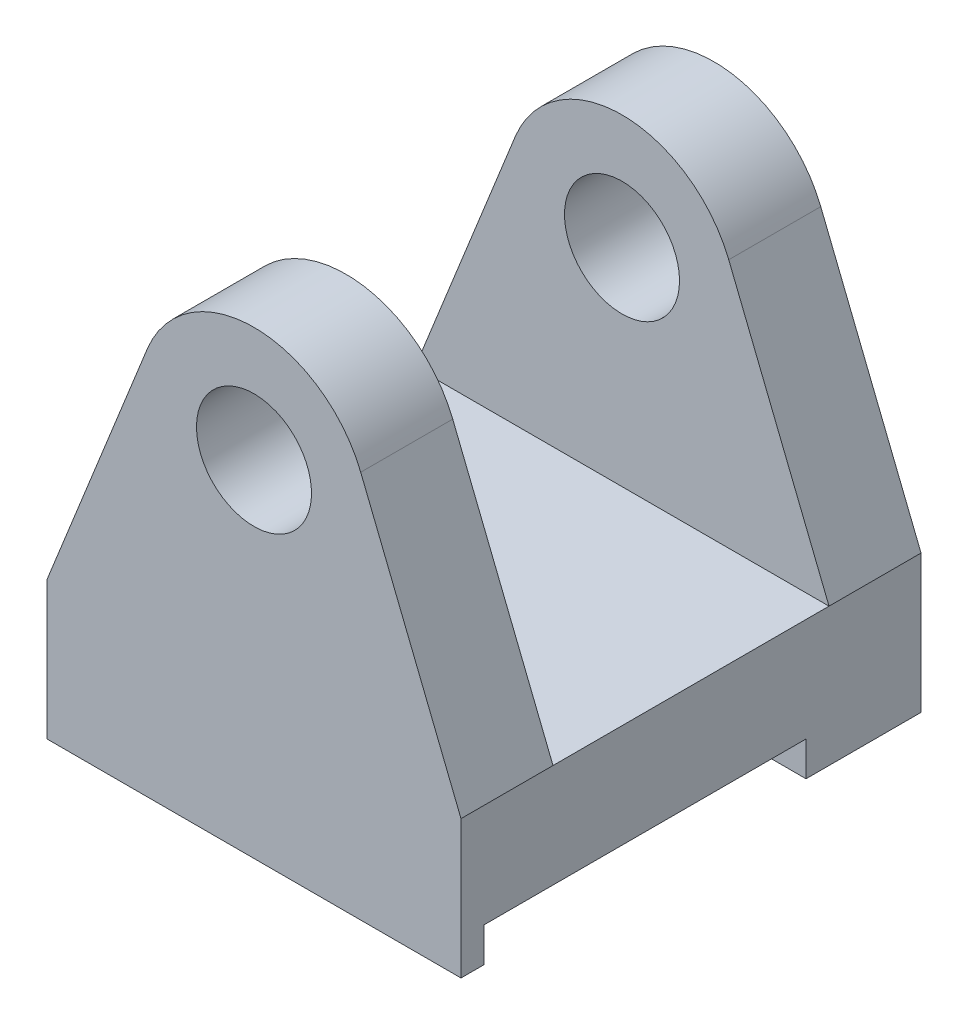
ISO-10303-21;
HEADER;
FILE_DESCRIPTION(('STEP AP214'),'2;1');
FILE_NAME('part.step','',(''),(''),'','','');
FILE_SCHEMA(('AUTOMOTIVE_DESIGN { 1 0 10303 214 1 1 1 1 }'));
ENDSEC;
DATA;
#1=APPLICATION_CONTEXT('core data for automotive mechanical design processes');
#2=APPLICATION_PROTOCOL_DEFINITION('international standard','automotive_design',2000,#1);
#3=PRODUCT_CONTEXT('',#1,'mechanical');
#4=PRODUCT('Part','Part','',(#3));
#5=PRODUCT_RELATED_PRODUCT_CATEGORY('part','',(#4));
#6=PRODUCT_DEFINITION_FORMATION('','',#4);
#7=PRODUCT_DEFINITION_CONTEXT('part definition',#1,'design');
#8=PRODUCT_DEFINITION('design','',#6,#7);
#9=PRODUCT_DEFINITION_SHAPE('','',#8);
#10=(LENGTH_UNIT() NAMED_UNIT(*) SI_UNIT(.MILLI.,.METRE.));
#11=(NAMED_UNIT(*) PLANE_ANGLE_UNIT() SI_UNIT($,.RADIAN.));
#12=(NAMED_UNIT(*) SI_UNIT($,.STERADIAN.) SOLID_ANGLE_UNIT());
#13=UNCERTAINTY_MEASURE_WITH_UNIT(LENGTH_MEASURE(1.E-05),#10,'distance_accuracy_value','');
#14=(GEOMETRIC_REPRESENTATION_CONTEXT(3) GLOBAL_UNCERTAINTY_ASSIGNED_CONTEXT((#13)) GLOBAL_UNIT_ASSIGNED_CONTEXT((#10,
#11,#12)) REPRESENTATION_CONTEXT('',''));
#15=CARTESIAN_POINT('',(0.,0.,0.));
#16=DIRECTION('',(0.,0.,1.));
#17=DIRECTION('',(1.,0.,0.));
#18=AXIS2_PLACEMENT_3D('',#15,#16,#17);
#19=CARTESIAN_POINT('',(0.,0.,0.));
#20=DIRECTION('',(0.,-1.,0.));
#21=DIRECTION('',(0.,0.,-1.));
#22=AXIS2_PLACEMENT_3D('',#19,#20,#21);
#23=PLANE('',#22);
#24=DIRECTION('',(0.,0.,-1.));
#25=VECTOR('',#24,1.);
#26=CARTESIAN_POINT('',(9.,0.,10.));
#27=LINE('',#26,#25);
#28=CARTESIAN_POINT('',(9.,0.,-5.));
#29=VERTEX_POINT('',#28);
#30=CARTESIAN_POINT('',(9.,0.,-10.));
#31=VERTEX_POINT('',#30);
#32=EDGE_CURVE('E160',#29,#31,#27,.T.);
#33=ORIENTED_EDGE('',*,*,#32,.F.);
#34=DIRECTION('',(-1.,0.,0.));
#35=VECTOR('',#34,1.);
#36=CARTESIAN_POINT('',(9.,0.,-5.));
#37=LINE('',#36,#35);
#38=CARTESIAN_POINT('',(-9.,0.,-5.));
#39=VERTEX_POINT('',#38);
#40=EDGE_CURVE('E142',#29,#39,#37,.T.);
#41=ORIENTED_EDGE('',*,*,#40,.T.);
#42=DIRECTION('',(0.,0.,1.));
#43=VECTOR('',#42,1.);
#44=CARTESIAN_POINT('',(-9.,0.,10.));
#45=LINE('',#44,#43);
#46=CARTESIAN_POINT('',(-9.,0.,-10.));
#47=VERTEX_POINT('',#46);
#48=EDGE_CURVE('E180',#47,#39,#45,.T.);
#49=ORIENTED_EDGE('',*,*,#48,.F.);
#50=DIRECTION('',(-1.,0.,0.));
#51=VECTOR('',#50,1.);
#52=CARTESIAN_POINT('',(-9.,0.,-10.));
#53=LINE('',#52,#51);
#54=EDGE_CURVE('E163',#31,#47,#53,.T.);
#55=ORIENTED_EDGE('',*,*,#54,.F.);
#56=EDGE_LOOP('',(#33,#41,#49,#55));
#57=FACE_BOUND('',#56,.T.);
#58=ADVANCED_FACE('F41',(#57),#23,.T.);
#59=CARTESIAN_POINT('',(-9.,6.,10.));
#60=DIRECTION('',(1.,0.,0.));
#61=DIRECTION('',(0.,0.,-1.));
#62=AXIS2_PLACEMENT_3D('',#59,#60,#61);
#63=PLANE('',#62);
#64=DIRECTION('',(0.,-1.,0.));
#65=VECTOR('',#64,1.);
#66=CARTESIAN_POINT('',(-9.,1.5,-5.));
#67=LINE('',#66,#65);
#68=CARTESIAN_POINT('',(-9.,1.5,-5.));
#69=VERTEX_POINT('',#68);
#70=EDGE_CURVE('E146',#69,#39,#67,.T.);
#71=ORIENTED_EDGE('',*,*,#70,.F.);
#72=DIRECTION('',(0.,0.,-1.));
#73=VECTOR('',#72,1.);
#74=CARTESIAN_POINT('',(-9.,1.5,-5.));
#75=LINE('',#74,#73);
#76=CARTESIAN_POINT('',(-9.,1.5,9.));
#77=VERTEX_POINT('',#76);
#78=EDGE_CURVE('E165',#77,#69,#75,.T.);
#79=ORIENTED_EDGE('',*,*,#78,.F.);
#80=DIRECTION('',(0.,1.,0.));
#81=VECTOR('',#80,1.);
#82=CARTESIAN_POINT('',(-9.,1.5,9.));
#83=LINE('',#82,#81);
#84=CARTESIAN_POINT('',(-9.,0.,9.));
#85=VERTEX_POINT('',#84);
#86=EDGE_CURVE('E57',#85,#77,#83,.T.);
#87=ORIENTED_EDGE('',*,*,#86,.F.);
#88=CARTESIAN_POINT('',(-9.,0.,10.));
#89=VERTEX_POINT('',#88);
#90=EDGE_CURVE('E178',#85,#89,#45,.T.);
#91=ORIENTED_EDGE('',*,*,#90,.T.);
#92=DIRECTION('',(0.,-1.,0.));
#93=VECTOR('',#92,1.);
#94=CARTESIAN_POINT('',(-9.,6.,10.));
#95=LINE('',#94,#93);
#96=CARTESIAN_POINT('',(-9.,6.,10.));
#97=VERTEX_POINT('',#96);
#98=EDGE_CURVE('E183',#97,#89,#95,.T.);
#99=ORIENTED_EDGE('',*,*,#98,.F.);
#100=DIRECTION('',(0.,0.,1.));
#101=VECTOR('',#100,1.);
#102=CARTESIAN_POINT('',(-9.,6.,6.));
#103=LINE('',#102,#101);
#104=CARTESIAN_POINT('',(-9.,6.,6.));
#105=VERTEX_POINT('',#104);
#106=EDGE_CURVE('E166',#105,#97,#103,.T.);
#107=ORIENTED_EDGE('',*,*,#106,.F.);
#108=DIRECTION('',(0.,0.,1.));
#109=VECTOR('',#108,1.);
#110=CARTESIAN_POINT('',(-9.,6.,10.));
#111=LINE('',#110,#109);
#112=CARTESIAN_POINT('',(-9.,6.,-6.));
#113=VERTEX_POINT('',#112);
#114=EDGE_CURVE('E267',#113,#105,#111,.T.);
#115=ORIENTED_EDGE('',*,*,#114,.F.);
#116=CARTESIAN_POINT('',(-9.,6.,-10.));
#117=VERTEX_POINT('',#116);
#118=EDGE_CURVE('E174',#117,#113,#111,.T.);
#119=ORIENTED_EDGE('',*,*,#118,.F.);
#120=DIRECTION('',(0.,-1.,0.));
#121=VECTOR('',#120,1.);
#122=CARTESIAN_POINT('',(-9.,6.,-10.));
#123=LINE('',#122,#121);
#124=EDGE_CURVE('E47',#117,#47,#123,.T.);
#125=ORIENTED_EDGE('',*,*,#124,.T.);
#126=ORIENTED_EDGE('',*,*,#48,.T.);
#127=EDGE_LOOP('',(#71,#79,#87,#91,#99,#107,#115,#119,#125,#126));
#128=FACE_BOUND('',#127,.T.);
#129=ADVANCED_FACE('F188',(#128),#63,.F.);
#130=CARTESIAN_POINT('',(0.,6.,0.));
#131=DIRECTION('',(0.,-1.,0.));
#132=DIRECTION('',(0.,0.,-1.));
#133=AXIS2_PLACEMENT_3D('',#130,#131,#132);
#134=PLANE('',#133);
#135=DIRECTION('',(1.,0.,0.));
#136=VECTOR('',#135,1.);
#137=CARTESIAN_POINT('',(-9.,6.,-6.));
#138=LINE('',#137,#136);
#139=CARTESIAN_POINT('',(9.,6.,-6.));
#140=VERTEX_POINT('',#139);
#141=EDGE_CURVE('E61',#113,#140,#138,.T.);
#142=ORIENTED_EDGE('',*,*,#141,.F.);
#143=ORIENTED_EDGE('',*,*,#114,.T.);
#144=DIRECTION('',(1.,0.,0.));
#145=VECTOR('',#144,1.);
#146=CARTESIAN_POINT('',(-9.,6.,6.));
#147=LINE('',#146,#145);
#148=CARTESIAN_POINT('',(9.,6.,6.));
#149=VERTEX_POINT('',#148);
#150=EDGE_CURVE('E252',#105,#149,#147,.T.);
#151=ORIENTED_EDGE('',*,*,#150,.T.);
#152=DIRECTION('',(0.,0.,-1.));
#153=VECTOR('',#152,1.);
#154=CARTESIAN_POINT('',(9.,6.,10.));
#155=LINE('',#154,#153);
#156=EDGE_CURVE('E182',#149,#140,#155,.T.);
#157=ORIENTED_EDGE('',*,*,#156,.T.);
#158=EDGE_LOOP('',(#142,#143,#151,#157));
#159=FACE_BOUND('',#158,.T.);
#160=ADVANCED_FACE('F271',(#159),#134,.F.);
#161=CARTESIAN_POINT('',(9.,6.,10.));
#162=DIRECTION('',(-1.,0.,0.));
#163=DIRECTION('',(0.,0.,1.));
#164=AXIS2_PLACEMENT_3D('',#161,#162,#163);
#165=PLANE('',#164);
#166=DIRECTION('',(0.,0.,-1.));
#167=VECTOR('',#166,1.);
#168=CARTESIAN_POINT('',(9.,1.5,-5.));
#169=LINE('',#168,#167);
#170=CARTESIAN_POINT('',(9.,1.5,9.));
#171=VERTEX_POINT('',#170);
#172=CARTESIAN_POINT('',(9.,1.5,-5.));
#173=VERTEX_POINT('',#172);
#174=EDGE_CURVE('E152',#171,#173,#169,.T.);
#175=ORIENTED_EDGE('',*,*,#174,.T.);
#176=DIRECTION('',(0.,-1.,0.));
#177=VECTOR('',#176,1.);
#178=CARTESIAN_POINT('',(9.,1.5,-5.));
#179=LINE('',#178,#177);
#180=EDGE_CURVE('E144',#173,#29,#179,.T.);
#181=ORIENTED_EDGE('',*,*,#180,.T.);
#182=ORIENTED_EDGE('',*,*,#32,.T.);
#183=DIRECTION('',(0.,-1.,0.));
#184=VECTOR('',#183,1.);
#185=CARTESIAN_POINT('',(9.,6.,-10.));
#186=LINE('',#185,#184);
#187=CARTESIAN_POINT('',(9.,6.,-10.));
#188=VERTEX_POINT('',#187);
#189=EDGE_CURVE('E11',#188,#31,#186,.T.);
#190=ORIENTED_EDGE('',*,*,#189,.F.);
#191=DIRECTION('',(0.,0.,-1.));
#192=VECTOR('',#191,1.);
#193=CARTESIAN_POINT('',(9.,6.,-6.));
#194=LINE('',#193,#192);
#195=EDGE_CURVE('E204',#140,#188,#194,.T.);
#196=ORIENTED_EDGE('',*,*,#195,.F.);
#197=ORIENTED_EDGE('',*,*,#156,.F.);
#198=CARTESIAN_POINT('',(9.,6.,10.));
#199=VERTEX_POINT('',#198);
#200=EDGE_CURVE('E270',#199,#149,#155,.T.);
#201=ORIENTED_EDGE('',*,*,#200,.F.);
#202=DIRECTION('',(0.,-1.,0.));
#203=VECTOR('',#202,1.);
#204=CARTESIAN_POINT('',(9.,6.,10.));
#205=LINE('',#204,#203);
#206=CARTESIAN_POINT('',(9.,0.,10.));
#207=VERTEX_POINT('',#206);
#208=EDGE_CURVE('E185',#199,#207,#205,.T.);
#209=ORIENTED_EDGE('',*,*,#208,.T.);
#210=CARTESIAN_POINT('',(9.,0.,9.));
#211=VERTEX_POINT('',#210);
#212=EDGE_CURVE('E164',#207,#211,#27,.T.);
#213=ORIENTED_EDGE('',*,*,#212,.T.);
#214=DIRECTION('',(0.,1.,0.));
#215=VECTOR('',#214,1.);
#216=CARTESIAN_POINT('',(9.,1.5,9.));
#217=LINE('',#216,#215);
#218=EDGE_CURVE('E161',#211,#171,#217,.T.);
#219=ORIENTED_EDGE('',*,*,#218,.T.);
#220=EDGE_LOOP('',(#175,#181,#182,#190,#196,#197,#201,#209,#213,#219));
#221=FACE_BOUND('',#220,.T.);
#222=ADVANCED_FACE('F43',(#221),#165,.F.);
#223=CARTESIAN_POINT('',(-9.,6.,-10.));
#224=DIRECTION('',(0.,0.,1.));
#225=DIRECTION('',(1.,0.,0.));
#226=AXIS2_PLACEMENT_3D('',#223,#224,#225);
#227=PLANE('',#226);
#228=ORIENTED_EDGE('',*,*,#54,.T.);
#229=ORIENTED_EDGE('',*,*,#124,.F.);
#230=DIRECTION('',(-0.372483328373312,-0.928038883928868,0.));
#231=VECTOR('',#230,1.);
#232=CARTESIAN_POINT('',(-9.,6.,-10.));
#233=LINE('',#232,#231);
#234=CARTESIAN_POINT('',(-4.64019441964434,16.8624166418666,-10.));
#235=VERTEX_POINT('',#234);
#236=EDGE_CURVE('E196',#235,#117,#233,.T.);
#237=ORIENTED_EDGE('',*,*,#236,.F.);
#238=CARTESIAN_POINT('',(0.,15.,-10.));
#239=DIRECTION('',(0.,0.,1.));
#240=DIRECTION('',(1.,0.,0.));
#241=AXIS2_PLACEMENT_3D('',#238,#239,#240);
#242=CIRCLE('',#241,5.);
#243=CARTESIAN_POINT('',(4.64019441964434,16.8624166418666,-10.));
#244=VERTEX_POINT('',#243);
#245=EDGE_CURVE('E223',#244,#235,#242,.T.);
#246=ORIENTED_EDGE('',*,*,#245,.F.);
#247=DIRECTION('',(-0.372483328373313,0.928038883928868,0.));
#248=VECTOR('',#247,1.);
#249=CARTESIAN_POINT('',(6.5026110615109,12.2222222222222,-10.));
#250=LINE('',#249,#248);
#251=EDGE_CURVE('E199',#188,#244,#250,.T.);
#252=ORIENTED_EDGE('',*,*,#251,.F.);
#253=ORIENTED_EDGE('',*,*,#189,.T.);
#254=EDGE_LOOP('',(#228,#229,#237,#246,#252,#253));
#255=FACE_BOUND('',#254,.T.);
#256=CARTESIAN_POINT('',(0.,15.,-10.));
#257=DIRECTION('',(0.,0.,1.));
#258=DIRECTION('',(1.,0.,0.));
#259=AXIS2_PLACEMENT_3D('',#256,#257,#258);
#260=CIRCLE('',#259,2.5);
#261=CARTESIAN_POINT('',(2.5,15.,-10.));
#262=VERTEX_POINT('',#261);
#263=EDGE_CURVE('E229',#262,#262,#260,.T.);
#264=ORIENTED_EDGE('',*,*,#263,.T.);
#265=EDGE_LOOP('',(#264));
#266=FACE_BOUND('',#265,.T.);
#267=ADVANCED_FACE('F194',(#255,#266),#227,.F.);
#268=CARTESIAN_POINT('',(-9.,6.,10.));
#269=DIRECTION('',(0.,0.,-1.));
#270=DIRECTION('',(-1.,0.,0.));
#271=AXIS2_PLACEMENT_3D('',#268,#269,#270);
#272=PLANE('',#271);
#273=DIRECTION('',(1.,0.,0.));
#274=VECTOR('',#273,1.);
#275=CARTESIAN_POINT('',(-9.,0.,10.));
#276=LINE('',#275,#274);
#277=EDGE_CURVE('E177',#89,#207,#276,.T.);
#278=ORIENTED_EDGE('',*,*,#277,.T.);
#279=ORIENTED_EDGE('',*,*,#208,.F.);
#280=DIRECTION('',(-0.372483328373313,0.928038883928868,0.));
#281=VECTOR('',#280,1.);
#282=CARTESIAN_POINT('',(6.5026110615109,12.2222222222222,10.));
#283=LINE('',#282,#281);
#284=CARTESIAN_POINT('',(4.64019441964434,16.8624166418666,10.));
#285=VERTEX_POINT('',#284);
#286=EDGE_CURVE('E261',#199,#285,#283,.T.);
#287=ORIENTED_EDGE('',*,*,#286,.T.);
#288=CARTESIAN_POINT('',(0.,15.,10.));
#289=DIRECTION('',(0.,0.,-1.));
#290=DIRECTION('',(-1.,0.,0.));
#291=AXIS2_PLACEMENT_3D('',#288,#289,#290);
#292=CIRCLE('',#291,5.);
#293=CARTESIAN_POINT('',(-4.64019441964434,16.8624166418666,10.));
#294=VERTEX_POINT('',#293);
#295=EDGE_CURVE('E244',#294,#285,#292,.T.);
#296=ORIENTED_EDGE('',*,*,#295,.F.);
#297=DIRECTION('',(-0.372483328373312,-0.928038883928868,0.));
#298=VECTOR('',#297,1.);
#299=CARTESIAN_POINT('',(-9.,6.,10.));
#300=LINE('',#299,#298);
#301=EDGE_CURVE('E247',#294,#97,#300,.T.);
#302=ORIENTED_EDGE('',*,*,#301,.T.);
#303=ORIENTED_EDGE('',*,*,#98,.T.);
#304=EDGE_LOOP('',(#278,#279,#287,#296,#302,#303));
#305=FACE_BOUND('',#304,.T.);
#306=CARTESIAN_POINT('',(0.,15.,10.));
#307=DIRECTION('',(0.,0.,-1.));
#308=DIRECTION('',(-1.,0.,0.));
#309=AXIS2_PLACEMENT_3D('',#306,#307,#308);
#310=CIRCLE('',#309,2.5);
#311=CARTESIAN_POINT('',(-2.5,15.,10.));
#312=VERTEX_POINT('',#311);
#313=EDGE_CURVE('E208',#312,#312,#310,.T.);
#314=ORIENTED_EDGE('',*,*,#313,.T.);
#315=EDGE_LOOP('',(#314));
#316=FACE_BOUND('',#315,.T.);
#317=ADVANCED_FACE('F288',(#305,#316),#272,.F.);
#318=DIRECTION('',(-1.,0.,0.));
#319=VECTOR('',#318,1.);
#320=CARTESIAN_POINT('',(9.,0.,9.));
#321=LINE('',#320,#319);
#322=EDGE_CURVE('E153',#211,#85,#321,.T.);
#323=ORIENTED_EDGE('',*,*,#322,.F.);
#324=ORIENTED_EDGE('',*,*,#212,.F.);
#325=ORIENTED_EDGE('',*,*,#277,.F.);
#326=ORIENTED_EDGE('',*,*,#90,.F.);
#327=EDGE_LOOP('',(#323,#324,#325,#326));
#328=FACE_BOUND('',#327,.T.);
#329=ADVANCED_FACE('F291',(#328),#23,.T.);
#330=CARTESIAN_POINT('',(0.,15.,6.));
#331=DIRECTION('',(0.,0.,-1.));
#332=DIRECTION('',(-1.,0.,0.));
#333=AXIS2_PLACEMENT_3D('',#330,#331,#332);
#334=PLANE('',#333);
#335=CARTESIAN_POINT('',(0.,15.,6.));
#336=DIRECTION('',(0.,0.,-1.));
#337=DIRECTION('',(-1.,0.,0.));
#338=AXIS2_PLACEMENT_3D('',#335,#336,#337);
#339=CIRCLE('',#338,5.);
#340=CARTESIAN_POINT('',(-4.64019441964434,16.8624166418666,6.));
#341=VERTEX_POINT('',#340);
#342=CARTESIAN_POINT('',(4.64019441964434,16.8624166418666,6.));
#343=VERTEX_POINT('',#342);
#344=EDGE_CURVE('E248',#341,#343,#339,.T.);
#345=ORIENTED_EDGE('',*,*,#344,.T.);
#346=DIRECTION('',(-0.372483328373313,0.928038883928868,0.));
#347=VECTOR('',#346,1.);
#348=CARTESIAN_POINT('',(6.5026110615109,12.2222222222222,6.));
#349=LINE('',#348,#347);
#350=EDGE_CURVE('E246',#149,#343,#349,.T.);
#351=ORIENTED_EDGE('',*,*,#350,.F.);
#352=ORIENTED_EDGE('',*,*,#150,.F.);
#353=DIRECTION('',(-0.372483328373312,-0.928038883928868,0.));
#354=VECTOR('',#353,1.);
#355=CARTESIAN_POINT('',(-9.,6.,6.));
#356=LINE('',#355,#354);
#357=EDGE_CURVE('E254',#341,#105,#356,.T.);
#358=ORIENTED_EDGE('',*,*,#357,.F.);
#359=EDGE_LOOP('',(#345,#351,#352,#358));
#360=FACE_BOUND('',#359,.T.);
#361=CARTESIAN_POINT('',(0.,15.,6.));
#362=DIRECTION('',(0.,0.,-1.));
#363=DIRECTION('',(-1.,0.,0.));
#364=AXIS2_PLACEMENT_3D('',#361,#362,#363);
#365=CIRCLE('',#364,2.5);
#366=CARTESIAN_POINT('',(-2.5,15.,6.));
#367=VERTEX_POINT('',#366);
#368=EDGE_CURVE('E238',#367,#367,#365,.T.);
#369=ORIENTED_EDGE('',*,*,#368,.F.);
#370=EDGE_LOOP('',(#369));
#371=FACE_BOUND('',#370,.T.);
#372=ADVANCED_FACE('F274',(#360,#371),#334,.T.);
#373=CARTESIAN_POINT('',(0.,15.,6.));
#374=DIRECTION('',(0.,0.,1.));
#375=DIRECTION('',(1.,0.,0.));
#376=AXIS2_PLACEMENT_3D('',#373,#374,#375);
#377=CYLINDRICAL_SURFACE('',#376,5.);
#378=ORIENTED_EDGE('',*,*,#295,.T.);
#379=DIRECTION('',(0.,0.,1.));
#380=VECTOR('',#379,1.);
#381=CARTESIAN_POINT('',(4.64019441964434,16.8624166418666,6.));
#382=LINE('',#381,#380);
#383=EDGE_CURVE('E167',#343,#285,#382,.T.);
#384=ORIENTED_EDGE('',*,*,#383,.F.);
#385=ORIENTED_EDGE('',*,*,#344,.F.);
#386=DIRECTION('',(0.,0.,1.));
#387=VECTOR('',#386,1.);
#388=CARTESIAN_POINT('',(-4.64019441964434,16.8624166418666,6.));
#389=LINE('',#388,#387);
#390=EDGE_CURVE('E256',#341,#294,#389,.T.);
#391=ORIENTED_EDGE('',*,*,#390,.T.);
#392=EDGE_LOOP('',(#378,#384,#385,#391));
#393=FACE_BOUND('',#392,.T.);
#394=ADVANCED_FACE('F300',(#393),#377,.T.);
#395=CARTESIAN_POINT('',(6.5026110615109,12.2222222222222,6.));
#396=DIRECTION('',(0.928038883928868,0.372483328373313,0.));
#397=DIRECTION('',(-0.372483328373313,0.928038883928868,0.));
#398=AXIS2_PLACEMENT_3D('',#395,#396,#397);
#399=PLANE('',#398);
#400=ORIENTED_EDGE('',*,*,#286,.F.);
#401=ORIENTED_EDGE('',*,*,#200,.T.);
#402=ORIENTED_EDGE('',*,*,#350,.T.);
#403=ORIENTED_EDGE('',*,*,#383,.T.);
#404=EDGE_LOOP('',(#400,#401,#402,#403));
#405=FACE_BOUND('',#404,.T.);
#406=ADVANCED_FACE('F294',(#405),#399,.T.);
#407=CARTESIAN_POINT('',(-9.,6.,6.));
#408=DIRECTION('',(-0.928038883928868,0.372483328373312,0.));
#409=DIRECTION('',(-0.372483328373312,-0.928038883928868,0.));
#410=AXIS2_PLACEMENT_3D('',#407,#408,#409);
#411=PLANE('',#410);
#412=ORIENTED_EDGE('',*,*,#301,.F.);
#413=ORIENTED_EDGE('',*,*,#390,.F.);
#414=ORIENTED_EDGE('',*,*,#357,.T.);
#415=ORIENTED_EDGE('',*,*,#106,.T.);
#416=EDGE_LOOP('',(#412,#413,#414,#415));
#417=FACE_BOUND('',#416,.T.);
#418=ADVANCED_FACE('F278',(#417),#411,.T.);
#419=CARTESIAN_POINT('',(0.,15.,6.));
#420=DIRECTION('',(0.,0.,1.));
#421=DIRECTION('',(1.,0.,0.));
#422=AXIS2_PLACEMENT_3D('',#419,#420,#421);
#423=CYLINDRICAL_SURFACE('',#422,2.5);
#424=ORIENTED_EDGE('',*,*,#368,.T.);
#425=EDGE_LOOP('',(#424));
#426=FACE_BOUND('',#425,.T.);
#427=ORIENTED_EDGE('',*,*,#313,.F.);
#428=EDGE_LOOP('',(#427));
#429=FACE_BOUND('',#428,.T.);
#430=ADVANCED_FACE('F340',(#426,#429),#423,.F.);
#431=CARTESIAN_POINT('',(0.,15.,-6.));
#432=DIRECTION('',(0.,0.,1.));
#433=DIRECTION('',(1.,0.,0.));
#434=AXIS2_PLACEMENT_3D('',#431,#432,#433);
#435=PLANE('',#434);
#436=ORIENTED_EDGE('',*,*,#141,.T.);
#437=DIRECTION('',(-0.372483328373313,0.928038883928868,0.));
#438=VECTOR('',#437,1.);
#439=CARTESIAN_POINT('',(6.5026110615109,12.2222222222222,-6.));
#440=LINE('',#439,#438);
#441=CARTESIAN_POINT('',(4.64019441964434,16.8624166418666,-6.));
#442=VERTEX_POINT('',#441);
#443=EDGE_CURVE('E215',#140,#442,#440,.T.);
#444=ORIENTED_EDGE('',*,*,#443,.T.);
#445=CARTESIAN_POINT('',(0.,15.,-6.));
#446=DIRECTION('',(0.,0.,1.));
#447=DIRECTION('',(1.,0.,0.));
#448=AXIS2_PLACEMENT_3D('',#445,#446,#447);
#449=CIRCLE('',#448,5.);
#450=CARTESIAN_POINT('',(-4.64019441964434,16.8624166418666,-6.));
#451=VERTEX_POINT('',#450);
#452=EDGE_CURVE('E220',#442,#451,#449,.T.);
#453=ORIENTED_EDGE('',*,*,#452,.T.);
#454=DIRECTION('',(-0.372483328373312,-0.928038883928868,0.));
#455=VECTOR('',#454,1.);
#456=CARTESIAN_POINT('',(-9.,6.,-6.));
#457=LINE('',#456,#455);
#458=EDGE_CURVE('E224',#451,#113,#457,.T.);
#459=ORIENTED_EDGE('',*,*,#458,.T.);
#460=EDGE_LOOP('',(#436,#444,#453,#459));
#461=FACE_BOUND('',#460,.T.);
#462=CARTESIAN_POINT('',(0.,15.,-6.));
#463=DIRECTION('',(0.,0.,1.));
#464=DIRECTION('',(1.,0.,0.));
#465=AXIS2_PLACEMENT_3D('',#462,#463,#464);
#466=CIRCLE('',#465,2.5);
#467=CARTESIAN_POINT('',(2.5,15.,-6.));
#468=VERTEX_POINT('',#467);
#469=EDGE_CURVE('E234',#468,#468,#466,.T.);
#470=ORIENTED_EDGE('',*,*,#469,.F.);
#471=EDGE_LOOP('',(#470));
#472=FACE_BOUND('',#471,.T.);
#473=ADVANCED_FACE('F219',(#461,#472),#435,.T.);
#474=CARTESIAN_POINT('',(6.5026110615109,12.2222222222222,-6.));
#475=DIRECTION('',(-0.928038883928868,-0.372483328373313,0.));
#476=DIRECTION('',(0.372483328373313,-0.928038883928868,0.));
#477=AXIS2_PLACEMENT_3D('',#474,#475,#476);
#478=PLANE('',#477);
#479=ORIENTED_EDGE('',*,*,#251,.T.);
#480=DIRECTION('',(0.,0.,-1.));
#481=VECTOR('',#480,1.);
#482=CARTESIAN_POINT('',(4.64019441964434,16.8624166418666,-6.));
#483=LINE('',#482,#481);
#484=EDGE_CURVE('E207',#442,#244,#483,.T.);
#485=ORIENTED_EDGE('',*,*,#484,.F.);
#486=ORIENTED_EDGE('',*,*,#443,.F.);
#487=ORIENTED_EDGE('',*,*,#195,.T.);
#488=EDGE_LOOP('',(#479,#485,#486,#487));
#489=FACE_BOUND('',#488,.T.);
#490=ADVANCED_FACE('F213',(#489),#478,.F.);
#491=CARTESIAN_POINT('',(0.,15.,-6.));
#492=DIRECTION('',(0.,0.,-1.));
#493=DIRECTION('',(-1.,0.,0.));
#494=AXIS2_PLACEMENT_3D('',#491,#492,#493);
#495=CYLINDRICAL_SURFACE('',#494,5.);
#496=ORIENTED_EDGE('',*,*,#245,.T.);
#497=DIRECTION('',(0.,0.,-1.));
#498=VECTOR('',#497,1.);
#499=CARTESIAN_POINT('',(-4.64019441964434,16.8624166418666,-6.));
#500=LINE('',#499,#498);
#501=EDGE_CURVE('E231',#451,#235,#500,.T.);
#502=ORIENTED_EDGE('',*,*,#501,.F.);
#503=ORIENTED_EDGE('',*,*,#452,.F.);
#504=ORIENTED_EDGE('',*,*,#484,.T.);
#505=EDGE_LOOP('',(#496,#502,#503,#504));
#506=FACE_BOUND('',#505,.T.);
#507=ADVANCED_FACE('F401',(#506),#495,.T.);
#508=CARTESIAN_POINT('',(-9.,6.,-6.));
#509=DIRECTION('',(0.928038883928868,-0.372483328373312,0.));
#510=DIRECTION('',(0.372483328373312,0.928038883928868,0.));
#511=AXIS2_PLACEMENT_3D('',#508,#509,#510);
#512=PLANE('',#511);
#513=ORIENTED_EDGE('',*,*,#236,.T.);
#514=ORIENTED_EDGE('',*,*,#118,.T.);
#515=ORIENTED_EDGE('',*,*,#458,.F.);
#516=ORIENTED_EDGE('',*,*,#501,.T.);
#517=EDGE_LOOP('',(#513,#514,#515,#516));
#518=FACE_BOUND('',#517,.T.);
#519=ADVANCED_FACE('F415',(#518),#512,.F.);
#520=CARTESIAN_POINT('',(0.,15.,-6.));
#521=DIRECTION('',(0.,0.,-1.));
#522=DIRECTION('',(-1.,0.,0.));
#523=AXIS2_PLACEMENT_3D('',#520,#521,#522);
#524=CYLINDRICAL_SURFACE('',#523,2.5);
#525=ORIENTED_EDGE('',*,*,#469,.T.);
#526=EDGE_LOOP('',(#525));
#527=FACE_BOUND('',#526,.T.);
#528=ORIENTED_EDGE('',*,*,#263,.F.);
#529=EDGE_LOOP('',(#528));
#530=FACE_BOUND('',#529,.T.);
#531=ADVANCED_FACE('F425',(#527,#530),#524,.F.);
#532=CARTESIAN_POINT('',(9.,1.5,-5.));
#533=DIRECTION('',(0.,0.,-1.));
#534=DIRECTION('',(-1.,0.,0.));
#535=AXIS2_PLACEMENT_3D('',#532,#533,#534);
#536=PLANE('',#535);
#537=ORIENTED_EDGE('',*,*,#70,.T.);
#538=ORIENTED_EDGE('',*,*,#40,.F.);
#539=ORIENTED_EDGE('',*,*,#180,.F.);
#540=DIRECTION('',(-1.,0.,0.));
#541=VECTOR('',#540,1.);
#542=CARTESIAN_POINT('',(9.,1.5,-5.));
#543=LINE('',#542,#541);
#544=EDGE_CURVE('E473',#173,#69,#543,.T.);
#545=ORIENTED_EDGE('',*,*,#544,.T.);
#546=EDGE_LOOP('',(#537,#538,#539,#545));
#547=FACE_BOUND('',#546,.T.);
#548=ADVANCED_FACE('F145',(#547),#536,.F.);
#549=CARTESIAN_POINT('',(9.,1.5,-5.));
#550=DIRECTION('',(0.,1.,0.));
#551=DIRECTION('',(0.,0.,1.));
#552=AXIS2_PLACEMENT_3D('',#549,#550,#551);
#553=PLANE('',#552);
#554=ORIENTED_EDGE('',*,*,#78,.T.);
#555=ORIENTED_EDGE('',*,*,#544,.F.);
#556=ORIENTED_EDGE('',*,*,#174,.F.);
#557=DIRECTION('',(-1.,0.,0.));
#558=VECTOR('',#557,1.);
#559=CARTESIAN_POINT('',(9.,1.5,9.));
#560=LINE('',#559,#558);
#561=EDGE_CURVE('E472',#171,#77,#560,.T.);
#562=ORIENTED_EDGE('',*,*,#561,.T.);
#563=EDGE_LOOP('',(#554,#555,#556,#562));
#564=FACE_BOUND('',#563,.T.);
#565=ADVANCED_FACE('F449',(#564),#553,.F.);
#566=CARTESIAN_POINT('',(9.,1.5,9.));
#567=DIRECTION('',(0.,0.,1.));
#568=DIRECTION('',(1.,0.,0.));
#569=AXIS2_PLACEMENT_3D('',#566,#567,#568);
#570=PLANE('',#569);
#571=ORIENTED_EDGE('',*,*,#86,.T.);
#572=ORIENTED_EDGE('',*,*,#561,.F.);
#573=ORIENTED_EDGE('',*,*,#218,.F.);
#574=ORIENTED_EDGE('',*,*,#322,.T.);
#575=EDGE_LOOP('',(#571,#572,#573,#574));
#576=FACE_BOUND('',#575,.T.);
#577=ADVANCED_FACE('F460',(#576),#570,.F.);
#578=CLOSED_SHELL('',(#58,#129,#160,#222,#267,#317,#329,#372,#394,#406,#418,#430,#473,#490,#507,
#519,#531,#548,#565,#577));
#579=MANIFOLD_SOLID_BREP('B2',#578);
#580=ADVANCED_BREP_SHAPE_REPRESENTATION('',(#18,#579),#14);
#581=SHAPE_DEFINITION_REPRESENTATION(#9,#580);
ENDSEC;
END-ISO-10303-21;
